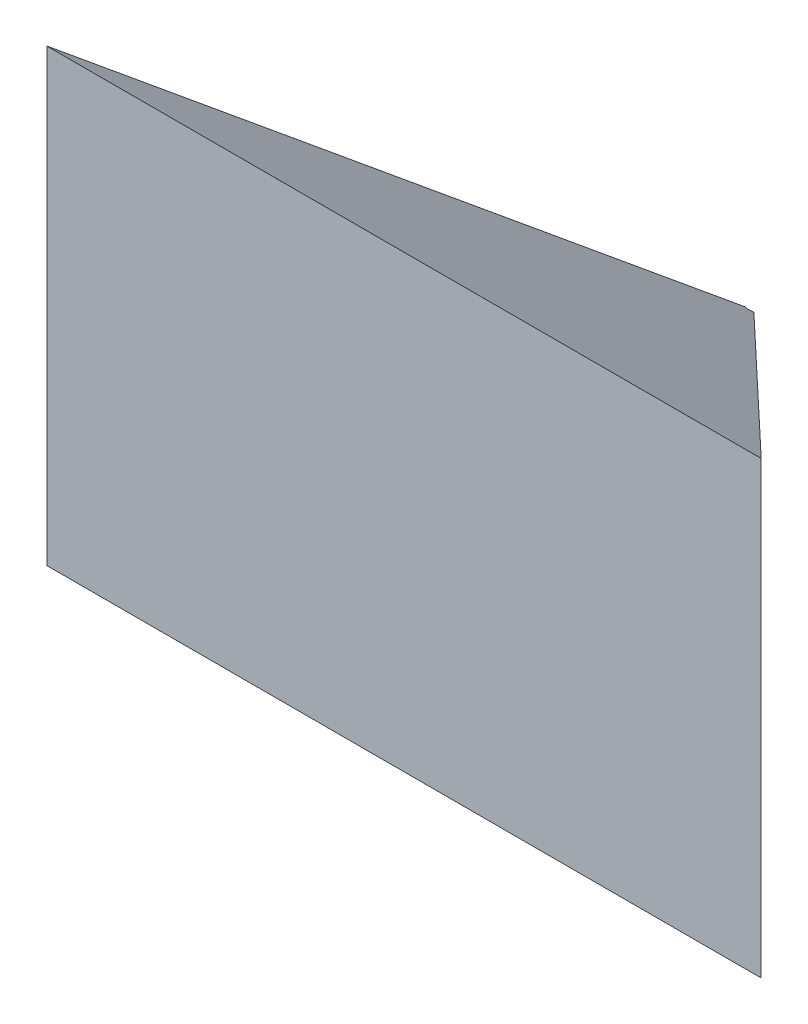
ISO-10303-21;
HEADER;
FILE_DESCRIPTION(('STEP AP214'),'2;1');
FILE_NAME('part.step','',(''),(''),'','','');
FILE_SCHEMA(('AUTOMOTIVE_DESIGN { 1 0 10303 214 1 1 1 1 }'));
ENDSEC;
DATA;
#1=APPLICATION_CONTEXT('core data for automotive mechanical design processes');
#2=APPLICATION_PROTOCOL_DEFINITION('international standard','automotive_design',2000,#1);
#3=PRODUCT_CONTEXT('',#1,'mechanical');
#4=PRODUCT('Part','Part','',(#3));
#5=PRODUCT_RELATED_PRODUCT_CATEGORY('part','',(#4));
#6=PRODUCT_DEFINITION_FORMATION('','',#4);
#7=PRODUCT_DEFINITION_CONTEXT('part definition',#1,'design');
#8=PRODUCT_DEFINITION('design','',#6,#7);
#9=PRODUCT_DEFINITION_SHAPE('','',#8);
#10=(LENGTH_UNIT() NAMED_UNIT(*) SI_UNIT(.MILLI.,.METRE.));
#11=(NAMED_UNIT(*) PLANE_ANGLE_UNIT() SI_UNIT($,.RADIAN.));
#12=(NAMED_UNIT(*) SI_UNIT($,.STERADIAN.) SOLID_ANGLE_UNIT());
#13=UNCERTAINTY_MEASURE_WITH_UNIT(LENGTH_MEASURE(1.E-05),#10,'distance_accuracy_value','');
#14=(GEOMETRIC_REPRESENTATION_CONTEXT(3) GLOBAL_UNCERTAINTY_ASSIGNED_CONTEXT((#13)) GLOBAL_UNIT_ASSIGNED_CONTEXT((#10,
#11,#12)) REPRESENTATION_CONTEXT('',''));
#15=CARTESIAN_POINT('',(0.,0.,0.));
#16=DIRECTION('',(0.,0.,1.));
#17=DIRECTION('',(1.,0.,0.));
#18=AXIS2_PLACEMENT_3D('',#15,#16,#17);
#19=CARTESIAN_POINT('',(-5.100000000002,3.6,-0.1));
#20=DIRECTION('',(0.699663340513364,0.,-0.714472679632805));
#21=DIRECTION('',(-0.714472679632805,0.,-0.699663340513364));
#22=AXIS2_PLACEMENT_3D('',#19,#20,#21);
#23=PLANE('',#22);
#24=DIRECTION('',(0.651533593847968,-0.410393936408816,0.638028834024316));
#25=VECTOR('',#24,1.);
#26=CARTESIAN_POINT('',(-7.02517514123118,-2.38735308210348,-1.98527078611034));
#27=LINE('',#26,#25);
#28=CARTESIAN_POINT('',(10206.5637854511,-6435.81614014354,9999.9));
#29=VERTEX_POINT('',#28);
#30=CARTESIAN_POINT('',(126.393063188092,-86.4260527496407,128.667521092338));
#31=VERTEX_POINT('',#30);
#32=EDGE_CURVE('E83',#29,#31,#27,.F.);
#33=ORIENTED_EDGE('',*,*,#32,.T.);
#34=CARTESIAN_POINT('',(-2.44660779512465,0.,2.4983936218677));
#35=DIRECTION('',(0.699663340513364,0.,-0.714472679632805));
#36=DIRECTION('',(-0.714472679632805,0.,-0.699663340513364));
#37=AXIS2_PLACEMENT_3D('',#34,#35,#36);
#38=CIRCLE('',#37,199.969428012402);
#39=CARTESIAN_POINT('',(126.393063188092,86.42605274964,128.667521092339));
#40=VERTEX_POINT('',#39);
#41=EDGE_CURVE('E47',#31,#40,#38,.F.);
#42=ORIENTED_EDGE('',*,*,#41,.T.);
#43=DIRECTION('',(-0.651533593847969,-0.410393936408811,-0.638028834024317));
#44=VECTOR('',#43,1.);
#45=CARTESIAN_POINT('',(-5.100000000002,3.6,-0.1));
#46=LINE('',#45,#44);
#47=CARTESIAN_POINT('',(10206.5637854511,6435.81614014343,9999.9));
#48=VERTEX_POINT('',#47);
#49=EDGE_CURVE('E87',#40,#48,#46,.F.);
#50=ORIENTED_EDGE('',*,*,#49,.T.);
#51=DIRECTION('',(0.,-1.,0.));
#52=VECTOR('',#51,1.);
#53=CARTESIAN_POINT('',(10206.5637854511,3.60000000000246,9999.9));
#54=LINE('',#53,#52);
#55=EDGE_CURVE('E85',#29,#48,#54,.F.);
#56=ORIENTED_EDGE('',*,*,#55,.F.);
#57=EDGE_LOOP('',(#33,#42,#50,#56));
#58=FACE_BOUND('',#57,.T.);
#59=ADVANCED_FACE('F32',(#58),#23,.T.);
#60=CARTESIAN_POINT('',(-17.900000000002,3.6,-0.1));
#61=DIRECTION('',(-0.699663340513364,0.,-0.714472679632805));
#62=DIRECTION('',(-0.714472679632805,0.,0.699663340513364));
#63=AXIS2_PLACEMENT_3D('',#60,#61,#62);
#64=PLANE('',#63);
#65=DIRECTION('',(-0.65153359384797,0.410393936408811,0.638028834024317));
#66=VECTOR('',#65,1.);
#67=CARTESIAN_POINT('',(-17.900000000002,3.6,-0.1));
#68=LINE('',#67,#66);
#69=CARTESIAN_POINT('',(-10229.5637854511,6435.81614014343,9999.9));
#70=VERTEX_POINT('',#69);
#71=CARTESIAN_POINT('',(-139.422436159075,80.1456630451932,118.903561723419));
#72=VERTEX_POINT('',#71);
#73=EDGE_CURVE('E77',#70,#72,#68,.F.);
#74=ORIENTED_EDGE('',*,*,#73,.T.);
#75=CARTESIAN_POINT('',(-8.81255437621865,0.,-8.99908423809502));
#76=DIRECTION('',(-0.699663340513364,0.,-0.714472679632805));
#77=DIRECTION('',(-0.714472679632805,0.,0.699663340513364));
#78=AXIS2_PLACEMENT_3D('',#75,#76,#77);
#79=CIRCLE('',#78,199.602994386963);
#80=CARTESIAN_POINT('',(-139.422436159075,-80.1456630451938,118.903561723419));
#81=VERTEX_POINT('',#80);
#82=EDGE_CURVE('E72',#72,#81,#79,.F.);
#83=ORIENTED_EDGE('',*,*,#82,.T.);
#84=DIRECTION('',(0.651533593847968,0.410393936408816,-0.638028834024316));
#85=VECTOR('',#84,1.);
#86=CARTESIAN_POINT('',(-15.9748248587728,-2.38735308210348,-1.98527078611034));
#87=LINE('',#86,#85);
#88=CARTESIAN_POINT('',(-10229.5637854511,-6435.81614014354,9999.9));
#89=VERTEX_POINT('',#88);
#90=EDGE_CURVE('E54',#81,#89,#87,.F.);
#91=ORIENTED_EDGE('',*,*,#90,.T.);
#92=DIRECTION('',(0.,1.,0.));
#93=VECTOR('',#92,1.);
#94=CARTESIAN_POINT('',(-10229.5637854511,3.6,9999.9));
#95=LINE('',#94,#93);
#96=EDGE_CURVE('E40',#70,#89,#95,.F.);
#97=ORIENTED_EDGE('',*,*,#96,.F.);
#98=EDGE_LOOP('',(#74,#83,#91,#97));
#99=FACE_BOUND('',#98,.T.);
#100=ADVANCED_FACE('F34',(#99),#64,.T.);
#101=CARTESIAN_POINT('',(0.,0.,9999.9));
#102=DIRECTION('',(0.,0.,1.));
#103=DIRECTION('',(1.,0.,0.));
#104=AXIS2_PLACEMENT_3D('',#101,#102,#103);
#105=PLANE('',#104);
#106=DIRECTION('',(-1.,0.,0.));
#107=VECTOR('',#106,1.);
#108=CARTESIAN_POINT('',(0.,-6435.81614014353,9999.9));
#109=LINE('',#108,#107);
#110=EDGE_CURVE('E81',#29,#89,#109,.T.);
#111=ORIENTED_EDGE('',*,*,#110,.F.);
#112=ORIENTED_EDGE('',*,*,#55,.T.);
#113=DIRECTION('',(1.,0.,0.));
#114=VECTOR('',#113,1.);
#115=CARTESIAN_POINT('',(0.,6435.81614014344,9999.9));
#116=LINE('',#115,#114);
#117=EDGE_CURVE('E97',#70,#48,#116,.T.);
#118=ORIENTED_EDGE('',*,*,#117,.F.);
#119=ORIENTED_EDGE('',*,*,#96,.T.);
#120=EDGE_LOOP('',(#111,#112,#118,#119));
#121=FACE_BOUND('',#120,.T.);
#122=ADVANCED_FACE('F94',(#121),#105,.T.);
#123=CARTESIAN_POINT('',(-10229.5637854511,12631.7809499587,19632.6061697232));
#124=DIRECTION('',(0.,-0.841039012964396,0.540974471367989));
#125=DIRECTION('',(0.,-0.540974471367989,-0.841039012964396));
#126=AXIS2_PLACEMENT_3D('',#123,#124,#125);
#127=PLANE('',#126);
#128=ORIENTED_EDGE('',*,*,#49,.F.);
#129=CARTESIAN_POINT('',(0.,2.59194590032568,-1.66719562544532));
#130=DIRECTION('',(0.,-0.841039012964396,0.540974471367989));
#131=DIRECTION('',(0.,-0.540974471367989,-0.841039012964396));
#132=AXIS2_PLACEMENT_3D('',#129,#130,#131);
#133=CIRCLE('',#132,199.976254278342);
#134=EDGE_CURVE('E100',#40,#72,#133,.T.);
#135=ORIENTED_EDGE('',*,*,#134,.T.);
#136=ORIENTED_EDGE('',*,*,#73,.F.);
#137=ORIENTED_EDGE('',*,*,#117,.T.);
#138=EDGE_LOOP('',(#128,#135,#136,#137));
#139=FACE_BOUND('',#138,.T.);
#140=ADVANCED_FACE('F106',(#139),#127,.F.);
#141=CARTESIAN_POINT('',(-10229.5637854511,-3.59999999999948,-0.100000000000001));
#142=DIRECTION('',(0.,0.841039012964392,0.540974471367995));
#143=DIRECTION('',(0.,-0.540974471367995,0.841039012964392));
#144=AXIS2_PLACEMENT_3D('',#141,#142,#143);
#145=PLANE('',#144);
#146=ORIENTED_EDGE('',*,*,#90,.F.);
#147=CARTESIAN_POINT('',(0.,-2.5919459003247,-1.66719562544472));
#148=DIRECTION('',(0.,0.841039012964392,0.540974471367995));
#149=DIRECTION('',(0.,-0.540974471367995,0.841039012964392));
#150=AXIS2_PLACEMENT_3D('',#147,#148,#149);
#151=CIRCLE('',#150,199.976254278342);
#152=EDGE_CURVE('E11',#81,#31,#151,.T.);
#153=ORIENTED_EDGE('',*,*,#152,.T.);
#154=ORIENTED_EDGE('',*,*,#32,.F.);
#155=ORIENTED_EDGE('',*,*,#110,.T.);
#156=EDGE_LOOP('',(#146,#153,#154,#155));
#157=FACE_BOUND('',#156,.T.);
#158=ADVANCED_FACE('F79',(#157),#145,.F.);
#159=CARTESIAN_POINT('',(0.,0.,0.));
#160=DIRECTION('',(0.,1.,0.));
#161=DIRECTION('',(0.,0.,1.));
#162=AXIS2_PLACEMENT_3D('',#159,#160,#161);
#163=SPHERICAL_SURFACE('',#162,200.);
#164=ORIENTED_EDGE('',*,*,#41,.F.);
#165=ORIENTED_EDGE('',*,*,#152,.F.);
#166=ORIENTED_EDGE('',*,*,#82,.F.);
#167=ORIENTED_EDGE('',*,*,#134,.F.);
#168=EDGE_LOOP('',(#164,#165,#166,#167));
#169=FACE_BOUND('',#168,.T.);
#170=ADVANCED_FACE('F71',(#169),#163,.F.);
#171=CLOSED_SHELL('',(#59,#100,#122,#140,#158,#170));
#172=MANIFOLD_SOLID_BREP('B2',#171);
#173=ADVANCED_BREP_SHAPE_REPRESENTATION('',(#18,#172),#14);
#174=SHAPE_DEFINITION_REPRESENTATION(#9,#173);
ENDSEC;
END-ISO-10303-21;
